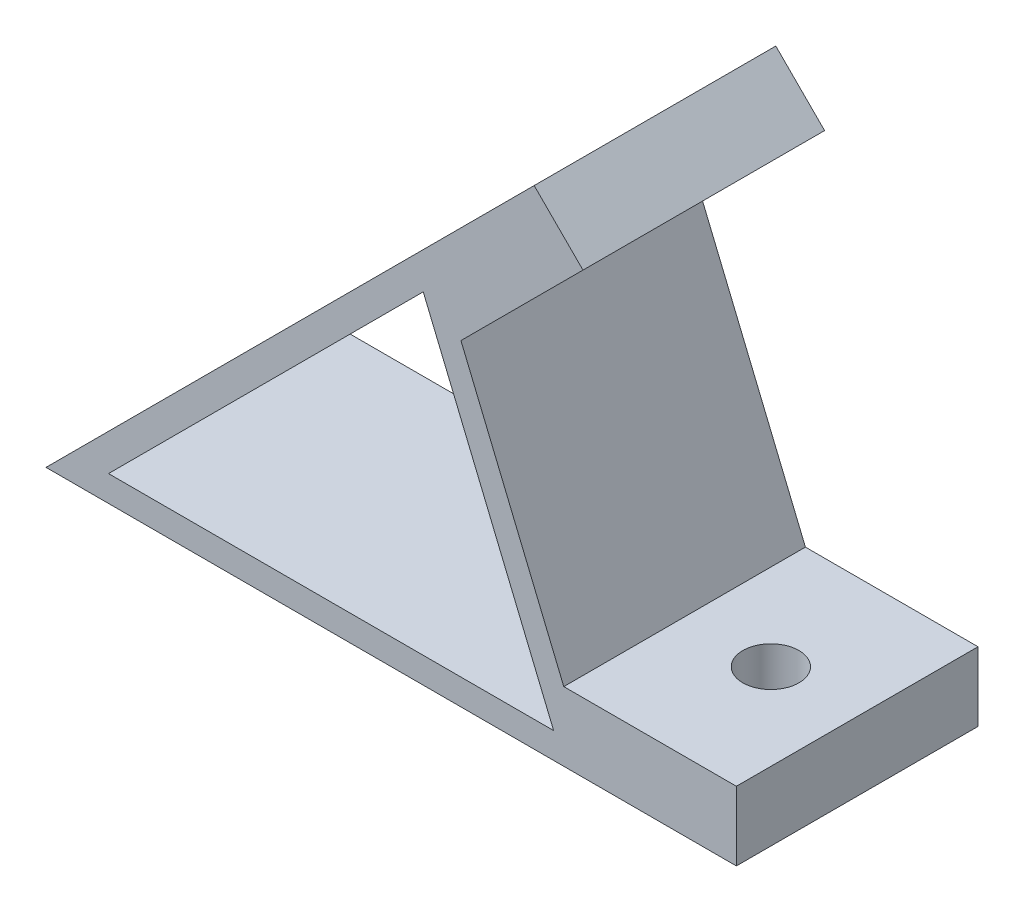
ISO-10303-21;
HEADER;
FILE_DESCRIPTION(('STEP AP214'),'2;1');
FILE_NAME('part.step','',(''),(''),'','','');
FILE_SCHEMA(('AUTOMOTIVE_DESIGN { 1 0 10303 214 1 1 1 1 }'));
ENDSEC;
DATA;
#1=APPLICATION_CONTEXT('core data for automotive mechanical design processes');
#2=APPLICATION_PROTOCOL_DEFINITION('international standard','automotive_design',2000,#1);
#3=PRODUCT_CONTEXT('',#1,'mechanical');
#4=PRODUCT('Part','Part','',(#3));
#5=PRODUCT_RELATED_PRODUCT_CATEGORY('part','',(#4));
#6=PRODUCT_DEFINITION_FORMATION('','',#4);
#7=PRODUCT_DEFINITION_CONTEXT('part definition',#1,'design');
#8=PRODUCT_DEFINITION('design','',#6,#7);
#9=PRODUCT_DEFINITION_SHAPE('','',#8);
#10=(LENGTH_UNIT() NAMED_UNIT(*) SI_UNIT(.MILLI.,.METRE.));
#11=(NAMED_UNIT(*) PLANE_ANGLE_UNIT() SI_UNIT($,.RADIAN.));
#12=(NAMED_UNIT(*) SI_UNIT($,.STERADIAN.) SOLID_ANGLE_UNIT());
#13=UNCERTAINTY_MEASURE_WITH_UNIT(LENGTH_MEASURE(1.E-05),#10,'distance_accuracy_value','');
#14=(GEOMETRIC_REPRESENTATION_CONTEXT(3) GLOBAL_UNCERTAINTY_ASSIGNED_CONTEXT((#13)) GLOBAL_UNIT_ASSIGNED_CONTEXT((#10,
#11,#12)) REPRESENTATION_CONTEXT('',''));
#15=CARTESIAN_POINT('',(0.,0.,0.));
#16=DIRECTION('',(0.,0.,1.));
#17=DIRECTION('',(1.,0.,0.));
#18=AXIS2_PLACEMENT_3D('',#15,#16,#17);
#19=CARTESIAN_POINT('',(0.,0.,28.));
#20=DIRECTION('',(0.,0.,-1.));
#21=DIRECTION('',(-1.,0.,0.));
#22=AXIS2_PLACEMENT_3D('',#19,#20,#21);
#23=PLANE('',#22);
#24=DIRECTION('',(-0.707106781186543,0.707106781186552,0.));
#25=VECTOR('',#24,1.);
#26=CARTESIAN_POINT('',(56.5685424949241,56.5685424949235,28.));
#27=LINE('',#26,#25);
#28=CARTESIAN_POINT('',(62.2253967444164,50.9116882454311,28.));
#29=VERTEX_POINT('',#28);
#30=CARTESIAN_POINT('',(56.5685424949241,56.5685424949235,28.));
#31=VERTEX_POINT('',#30);
#32=EDGE_CURVE('E141',#29,#31,#27,.T.);
#33=ORIENTED_EDGE('',*,*,#32,.T.);
#34=DIRECTION('',(-0.707106781186551,-0.707106781186544,0.));
#35=VECTOR('',#34,1.);
#36=CARTESIAN_POINT('',(56.5685424949241,56.5685424949235,28.));
#37=LINE('',#36,#35);
#38=CARTESIAN_POINT('',(0.,0.,28.));
#39=VERTEX_POINT('',#38);
#40=EDGE_CURVE('E144',#31,#39,#37,.T.);
#41=ORIENTED_EDGE('',*,*,#40,.T.);
#42=DIRECTION('',(1.,0.,0.));
#43=VECTOR('',#42,1.);
#44=CARTESIAN_POINT('',(0.,0.,28.));
#45=LINE('',#44,#43);
#46=CARTESIAN_POINT('',(80.,0.,28.));
#47=VERTEX_POINT('',#46);
#48=EDGE_CURVE('E147',#39,#47,#45,.T.);
#49=ORIENTED_EDGE('',*,*,#48,.T.);
#50=DIRECTION('',(0.,1.,0.));
#51=VECTOR('',#50,1.);
#52=CARTESIAN_POINT('',(80.,8.,28.));
#53=LINE('',#52,#51);
#54=CARTESIAN_POINT('',(80.,8.,28.));
#55=VERTEX_POINT('',#54);
#56=EDGE_CURVE('E149',#47,#55,#53,.T.);
#57=ORIENTED_EDGE('',*,*,#56,.T.);
#58=DIRECTION('',(-1.,0.,0.));
#59=VECTOR('',#58,1.);
#60=CARTESIAN_POINT('',(60.,8.,28.));
#61=LINE('',#60,#59);
#62=CARTESIAN_POINT('',(60.,8.,28.));
#63=VERTEX_POINT('',#62);
#64=EDGE_CURVE('E151',#55,#63,#61,.T.);
#65=ORIENTED_EDGE('',*,*,#64,.T.);
#66=DIRECTION('',(-0.382683432365088,0.923879532511288,0.));
#67=VECTOR('',#66,1.);
#68=CARTESIAN_POINT('',(48.0832611206854,36.7695526217002,28.));
#69=LINE('',#68,#67);
#70=CARTESIAN_POINT('',(48.0832611206854,36.7695526217002,28.));
#71=VERTEX_POINT('',#70);
#72=EDGE_CURVE('E153',#63,#71,#69,.T.);
#73=ORIENTED_EDGE('',*,*,#72,.T.);
#74=DIRECTION('',(0.707106781186551,0.707106781186544,0.));
#75=VECTOR('',#74,1.);
#76=CARTESIAN_POINT('',(62.2253967444164,50.9116882454311,28.));
#77=LINE('',#76,#75);
#78=EDGE_CURVE('E155',#71,#29,#77,.T.);
#79=ORIENTED_EDGE('',*,*,#78,.T.);
#80=EDGE_LOOP('',(#33,#41,#49,#57,#65,#73,#79));
#81=FACE_BOUND('',#80,.T.);
#82=DIRECTION('',(1.,0.,0.));
#83=VECTOR('',#82,1.);
#84=CARTESIAN_POINT('',(58.8238912109883,3.,28.));
#85=LINE('',#84,#83);
#86=CARTESIAN_POINT('',(7.24264068711934,2.99999999999999,28.));
#87=VERTEX_POINT('',#86);
#88=CARTESIAN_POINT('',(58.8238912109883,3.,28.));
#89=VERTEX_POINT('',#88);
#90=EDGE_CURVE('E112',#87,#89,#85,.T.);
#91=ORIENTED_EDGE('',*,*,#90,.F.);
#92=DIRECTION('',(-0.707106781186551,-0.707106781186544,0.));
#93=VECTOR('',#92,1.);
#94=CARTESIAN_POINT('',(7.24264068711934,2.99999999999999,28.));
#95=LINE('',#94,#93);
#96=CARTESIAN_POINT('',(43.7160927146294,39.4734520275097,28.));
#97=VERTEX_POINT('',#96);
#98=EDGE_CURVE('E129',#97,#87,#95,.T.);
#99=ORIENTED_EDGE('',*,*,#98,.F.);
#100=DIRECTION('',(-0.382683432365088,0.923879532511288,0.));
#101=VECTOR('',#100,1.);
#102=CARTESIAN_POINT('',(43.7160927146294,39.4734520275097,28.));
#103=LINE('',#102,#101);
#104=EDGE_CURVE('E120',#89,#97,#103,.T.);
#105=ORIENTED_EDGE('',*,*,#104,.F.);
#106=EDGE_LOOP('',(#91,#99,#105));
#107=FACE_BOUND('',#106,.T.);
#108=ADVANCED_FACE('F35',(#81,#107),#23,.F.);
#109=CARTESIAN_POINT('',(0.,0.,0.));
#110=DIRECTION('',(0.,0.,-1.));
#111=DIRECTION('',(-1.,0.,0.));
#112=AXIS2_PLACEMENT_3D('',#109,#110,#111);
#113=PLANE('',#112);
#114=DIRECTION('',(-0.707106781186543,0.707106781186552,0.));
#115=VECTOR('',#114,1.);
#116=CARTESIAN_POINT('',(56.5685424949241,56.5685424949235,0.));
#117=LINE('',#116,#115);
#118=CARTESIAN_POINT('',(62.2253967444164,50.9116882454311,0.));
#119=VERTEX_POINT('',#118);
#120=CARTESIAN_POINT('',(56.5685424949241,56.5685424949235,0.));
#121=VERTEX_POINT('',#120);
#122=EDGE_CURVE('E127',#119,#121,#117,.T.);
#123=ORIENTED_EDGE('',*,*,#122,.F.);
#124=DIRECTION('',(0.707106781186551,0.707106781186544,0.));
#125=VECTOR('',#124,1.);
#126=CARTESIAN_POINT('',(62.2253967444164,50.9116882454311,0.));
#127=LINE('',#126,#125);
#128=CARTESIAN_POINT('',(48.0832611206854,36.7695526217002,0.));
#129=VERTEX_POINT('',#128);
#130=EDGE_CURVE('E145',#129,#119,#127,.T.);
#131=ORIENTED_EDGE('',*,*,#130,.F.);
#132=DIRECTION('',(-0.382683432365088,0.923879532511288,0.));
#133=VECTOR('',#132,1.);
#134=CARTESIAN_POINT('',(48.0832611206854,36.7695526217002,0.));
#135=LINE('',#134,#133);
#136=CARTESIAN_POINT('',(60.,8.,0.));
#137=VERTEX_POINT('',#136);
#138=EDGE_CURVE('E168',#137,#129,#135,.T.);
#139=ORIENTED_EDGE('',*,*,#138,.F.);
#140=DIRECTION('',(-1.,0.,0.));
#141=VECTOR('',#140,1.);
#142=CARTESIAN_POINT('',(60.,8.,0.));
#143=LINE('',#142,#141);
#144=CARTESIAN_POINT('',(80.,8.,0.));
#145=VERTEX_POINT('',#144);
#146=EDGE_CURVE('E166',#145,#137,#143,.T.);
#147=ORIENTED_EDGE('',*,*,#146,.F.);
#148=DIRECTION('',(0.,1.,0.));
#149=VECTOR('',#148,1.);
#150=CARTESIAN_POINT('',(80.,8.,0.));
#151=LINE('',#150,#149);
#152=CARTESIAN_POINT('',(80.,0.,0.));
#153=VERTEX_POINT('',#152);
#154=EDGE_CURVE('E164',#153,#145,#151,.T.);
#155=ORIENTED_EDGE('',*,*,#154,.F.);
#156=DIRECTION('',(1.,0.,0.));
#157=VECTOR('',#156,1.);
#158=CARTESIAN_POINT('',(0.,0.,0.));
#159=LINE('',#158,#157);
#160=CARTESIAN_POINT('',(0.,0.,0.));
#161=VERTEX_POINT('',#160);
#162=EDGE_CURVE('E162',#161,#153,#159,.T.);
#163=ORIENTED_EDGE('',*,*,#162,.F.);
#164=DIRECTION('',(-0.707106781186551,-0.707106781186544,0.));
#165=VECTOR('',#164,1.);
#166=CARTESIAN_POINT('',(56.5685424949241,56.5685424949235,0.));
#167=LINE('',#166,#165);
#168=EDGE_CURVE('E160',#121,#161,#167,.T.);
#169=ORIENTED_EDGE('',*,*,#168,.F.);
#170=EDGE_LOOP('',(#123,#131,#139,#147,#155,#163,#169));
#171=FACE_BOUND('',#170,.T.);
#172=DIRECTION('',(-0.707106781186551,-0.707106781186544,0.));
#173=VECTOR('',#172,1.);
#174=CARTESIAN_POINT('',(7.24264068711934,2.99999999999999,0.));
#175=LINE('',#174,#173);
#176=CARTESIAN_POINT('',(43.7160927146294,39.4734520275097,0.));
#177=VERTEX_POINT('',#176);
#178=CARTESIAN_POINT('',(7.24264068711934,2.99999999999999,0.));
#179=VERTEX_POINT('',#178);
#180=EDGE_CURVE('E121',#177,#179,#175,.T.);
#181=ORIENTED_EDGE('',*,*,#180,.T.);
#182=DIRECTION('',(1.,0.,0.));
#183=VECTOR('',#182,1.);
#184=CARTESIAN_POINT('',(58.8238912109883,3.,0.));
#185=LINE('',#184,#183);
#186=CARTESIAN_POINT('',(58.8238912109883,3.,0.));
#187=VERTEX_POINT('',#186);
#188=EDGE_CURVE('E58',#179,#187,#185,.T.);
#189=ORIENTED_EDGE('',*,*,#188,.T.);
#190=DIRECTION('',(-0.382683432365088,0.923879532511288,0.));
#191=VECTOR('',#190,1.);
#192=CARTESIAN_POINT('',(43.7160927146294,39.4734520275097,0.));
#193=LINE('',#192,#191);
#194=EDGE_CURVE('E126',#187,#177,#193,.T.);
#195=ORIENTED_EDGE('',*,*,#194,.T.);
#196=EDGE_LOOP('',(#181,#189,#195));
#197=FACE_BOUND('',#196,.T.);
#198=ADVANCED_FACE('F195',(#171,#197),#113,.T.);
#199=CARTESIAN_POINT('',(56.5685424949241,56.5685424949235,28.));
#200=DIRECTION('',(-0.707106781186552,-0.707106781186543,0.));
#201=DIRECTION('',(0.707106781186543,-0.707106781186552,0.));
#202=AXIS2_PLACEMENT_3D('',#199,#200,#201);
#203=PLANE('',#202);
#204=ORIENTED_EDGE('',*,*,#122,.T.);
#205=DIRECTION('',(0.,0.,-1.));
#206=VECTOR('',#205,1.);
#207=CARTESIAN_POINT('',(56.5685424949241,56.5685424949235,28.));
#208=LINE('',#207,#206);
#209=EDGE_CURVE('E11',#31,#121,#208,.T.);
#210=ORIENTED_EDGE('',*,*,#209,.F.);
#211=ORIENTED_EDGE('',*,*,#32,.F.);
#212=DIRECTION('',(0.,0.,-1.));
#213=VECTOR('',#212,1.);
#214=CARTESIAN_POINT('',(62.2253967444164,50.9116882454311,28.));
#215=LINE('',#214,#213);
#216=EDGE_CURVE('E157',#29,#119,#215,.T.);
#217=ORIENTED_EDGE('',*,*,#216,.T.);
#218=EDGE_LOOP('',(#204,#210,#211,#217));
#219=FACE_BOUND('',#218,.T.);
#220=ADVANCED_FACE('F37',(#219),#203,.F.);
#221=CARTESIAN_POINT('',(56.5685424949241,56.5685424949235,28.));
#222=DIRECTION('',(0.707106781186544,-0.707106781186551,0.));
#223=DIRECTION('',(0.707106781186551,0.707106781186544,0.));
#224=AXIS2_PLACEMENT_3D('',#221,#222,#223);
#225=PLANE('',#224);
#226=CARTESIAN_POINT('',(49.4974746830586,49.4974746830581,14.));
#227=DIRECTION('',(0.707106781186544,-0.707106781186551,0.));
#228=DIRECTION('',(0.707106781186551,0.707106781186544,0.));
#229=AXIS2_PLACEMENT_3D('',#226,#227,#228);
#230=CIRCLE('',#229,3.25);
#231=CARTESIAN_POINT('',(51.7955717219149,51.7955717219143,14.));
#232=VERTEX_POINT('',#231);
#233=EDGE_CURVE('E262',#232,#232,#230,.T.);
#234=ORIENTED_EDGE('',*,*,#233,.T.);
#235=EDGE_LOOP('',(#234));
#236=FACE_BOUND('',#235,.T.);
#237=ORIENTED_EDGE('',*,*,#168,.T.);
#238=DIRECTION('',(0.,0.,-1.));
#239=VECTOR('',#238,1.);
#240=CARTESIAN_POINT('',(0.,0.,28.));
#241=LINE('',#240,#239);
#242=EDGE_CURVE('E43',#39,#161,#241,.T.);
#243=ORIENTED_EDGE('',*,*,#242,.F.);
#244=ORIENTED_EDGE('',*,*,#40,.F.);
#245=ORIENTED_EDGE('',*,*,#209,.T.);
#246=EDGE_LOOP('',(#237,#243,#244,#245));
#247=FACE_BOUND('',#246,.T.);
#248=ADVANCED_FACE('F212',(#236,#247),#225,.F.);
#249=CARTESIAN_POINT('',(0.,0.,28.));
#250=DIRECTION('',(0.,1.,0.));
#251=DIRECTION('',(0.,0.,1.));
#252=AXIS2_PLACEMENT_3D('',#249,#250,#251);
#253=PLANE('',#252);
#254=CARTESIAN_POINT('',(70.,0.,14.));
#255=DIRECTION('',(0.,1.,0.));
#256=DIRECTION('',(0.,0.,1.));
#257=AXIS2_PLACEMENT_3D('',#254,#255,#256);
#258=CIRCLE('',#257,3.25000000000001);
#259=CARTESIAN_POINT('',(70.,0.,17.25));
#260=VERTEX_POINT('',#259);
#261=EDGE_CURVE('E135',#260,#260,#258,.T.);
#262=ORIENTED_EDGE('',*,*,#261,.T.);
#263=EDGE_LOOP('',(#262));
#264=FACE_BOUND('',#263,.T.);
#265=ORIENTED_EDGE('',*,*,#162,.T.);
#266=DIRECTION('',(0.,0.,-1.));
#267=VECTOR('',#266,1.);
#268=CARTESIAN_POINT('',(80.,0.,28.));
#269=LINE('',#268,#267);
#270=EDGE_CURVE('E182',#47,#153,#269,.T.);
#271=ORIENTED_EDGE('',*,*,#270,.F.);
#272=ORIENTED_EDGE('',*,*,#48,.F.);
#273=ORIENTED_EDGE('',*,*,#242,.T.);
#274=EDGE_LOOP('',(#265,#271,#272,#273));
#275=FACE_BOUND('',#274,.T.);
#276=ADVANCED_FACE('F189',(#264,#275),#253,.F.);
#277=CARTESIAN_POINT('',(80.,8.,28.));
#278=DIRECTION('',(-1.,0.,0.));
#279=DIRECTION('',(0.,0.,1.));
#280=AXIS2_PLACEMENT_3D('',#277,#278,#279);
#281=PLANE('',#280);
#282=ORIENTED_EDGE('',*,*,#154,.T.);
#283=DIRECTION('',(0.,0.,-1.));
#284=VECTOR('',#283,1.);
#285=CARTESIAN_POINT('',(80.,8.,28.));
#286=LINE('',#285,#284);
#287=EDGE_CURVE('E179',#55,#145,#286,.T.);
#288=ORIENTED_EDGE('',*,*,#287,.F.);
#289=ORIENTED_EDGE('',*,*,#56,.F.);
#290=ORIENTED_EDGE('',*,*,#270,.T.);
#291=EDGE_LOOP('',(#282,#288,#289,#290));
#292=FACE_BOUND('',#291,.T.);
#293=ADVANCED_FACE('F201',(#292),#281,.F.);
#294=CARTESIAN_POINT('',(60.,8.,28.));
#295=DIRECTION('',(0.,-1.,0.));
#296=DIRECTION('',(0.,0.,-1.));
#297=AXIS2_PLACEMENT_3D('',#294,#295,#296);
#298=PLANE('',#297);
#299=CARTESIAN_POINT('',(70.,8.,14.));
#300=DIRECTION('',(0.,1.,0.));
#301=DIRECTION('',(0.,0.,1.));
#302=AXIS2_PLACEMENT_3D('',#299,#300,#301);
#303=CIRCLE('',#302,3.25000000000001);
#304=CARTESIAN_POINT('',(70.,8.,17.25));
#305=VERTEX_POINT('',#304);
#306=EDGE_CURVE('E264',#305,#305,#303,.T.);
#307=ORIENTED_EDGE('',*,*,#306,.F.);
#308=EDGE_LOOP('',(#307));
#309=FACE_BOUND('',#308,.T.);
#310=ORIENTED_EDGE('',*,*,#146,.T.);
#311=DIRECTION('',(0.,0.,-1.));
#312=VECTOR('',#311,1.);
#313=CARTESIAN_POINT('',(60.,8.,28.));
#314=LINE('',#313,#312);
#315=EDGE_CURVE('E176',#63,#137,#314,.T.);
#316=ORIENTED_EDGE('',*,*,#315,.F.);
#317=ORIENTED_EDGE('',*,*,#64,.F.);
#318=ORIENTED_EDGE('',*,*,#287,.T.);
#319=EDGE_LOOP('',(#310,#316,#317,#318));
#320=FACE_BOUND('',#319,.T.);
#321=ADVANCED_FACE('F205',(#309,#320),#298,.F.);
#322=CARTESIAN_POINT('',(48.0832611206854,36.7695526217002,28.));
#323=DIRECTION('',(-0.923879532511288,-0.382683432365088,0.));
#324=DIRECTION('',(0.382683432365088,-0.923879532511288,0.));
#325=AXIS2_PLACEMENT_3D('',#322,#323,#324);
#326=PLANE('',#325);
#327=ORIENTED_EDGE('',*,*,#138,.T.);
#328=DIRECTION('',(0.,0.,-1.));
#329=VECTOR('',#328,1.);
#330=CARTESIAN_POINT('',(48.0832611206854,36.7695526217002,28.));
#331=LINE('',#330,#329);
#332=EDGE_CURVE('E173',#71,#129,#331,.T.);
#333=ORIENTED_EDGE('',*,*,#332,.F.);
#334=ORIENTED_EDGE('',*,*,#72,.F.);
#335=ORIENTED_EDGE('',*,*,#315,.T.);
#336=EDGE_LOOP('',(#327,#333,#334,#335));
#337=FACE_BOUND('',#336,.T.);
#338=ADVANCED_FACE('F220',(#337),#326,.F.);
#339=CARTESIAN_POINT('',(62.2253967444164,50.9116882454311,28.));
#340=DIRECTION('',(-0.707106781186544,0.707106781186551,0.));
#341=DIRECTION('',(-0.707106781186551,-0.707106781186544,0.));
#342=AXIS2_PLACEMENT_3D('',#339,#340,#341);
#343=PLANE('',#342);
#344=CARTESIAN_POINT('',(55.1543289325509,43.8406204335657,14.));
#345=DIRECTION('',(0.707106781186544,-0.707106781186551,0.));
#346=DIRECTION('',(0.707106781186551,0.707106781186544,0.));
#347=AXIS2_PLACEMENT_3D('',#344,#345,#346);
#348=CIRCLE('',#347,3.25);
#349=CARTESIAN_POINT('',(57.4524259714072,46.1387174724219,14.));
#350=VERTEX_POINT('',#349);
#351=EDGE_CURVE('E259',#350,#350,#348,.T.);
#352=ORIENTED_EDGE('',*,*,#351,.F.);
#353=EDGE_LOOP('',(#352));
#354=FACE_BOUND('',#353,.T.);
#355=ORIENTED_EDGE('',*,*,#130,.T.);
#356=ORIENTED_EDGE('',*,*,#216,.F.);
#357=ORIENTED_EDGE('',*,*,#78,.F.);
#358=ORIENTED_EDGE('',*,*,#332,.T.);
#359=EDGE_LOOP('',(#355,#356,#357,#358));
#360=FACE_BOUND('',#359,.T.);
#361=ADVANCED_FACE('F217',(#354,#360),#343,.F.);
#362=CARTESIAN_POINT('',(58.8238912109883,3.,28.));
#363=DIRECTION('',(0.,1.,0.));
#364=DIRECTION('',(-1.,0.,0.));
#365=AXIS2_PLACEMENT_3D('',#362,#363,#364);
#366=PLANE('',#365);
#367=ORIENTED_EDGE('',*,*,#188,.F.);
#368=DIRECTION('',(0.,0.,-1.));
#369=VECTOR('',#368,1.);
#370=CARTESIAN_POINT('',(7.24264068711934,2.99999999999999,28.));
#371=LINE('',#370,#369);
#372=EDGE_CURVE('E116',#87,#179,#371,.T.);
#373=ORIENTED_EDGE('',*,*,#372,.F.);
#374=ORIENTED_EDGE('',*,*,#90,.T.);
#375=DIRECTION('',(0.,0.,-1.));
#376=VECTOR('',#375,1.);
#377=CARTESIAN_POINT('',(58.8238912109883,3.,28.));
#378=LINE('',#377,#376);
#379=EDGE_CURVE('E115',#89,#187,#378,.T.);
#380=ORIENTED_EDGE('',*,*,#379,.T.);
#381=EDGE_LOOP('',(#367,#373,#374,#380));
#382=FACE_BOUND('',#381,.T.);
#383=ADVANCED_FACE('F114',(#382),#366,.T.);
#384=CARTESIAN_POINT('',(43.7160927146294,39.4734520275097,28.));
#385=DIRECTION('',(-0.923879532511288,-0.382683432365087,0.));
#386=DIRECTION('',(0.382683432365087,-0.923879532511288,0.));
#387=AXIS2_PLACEMENT_3D('',#384,#385,#386);
#388=PLANE('',#387);
#389=ORIENTED_EDGE('',*,*,#194,.F.);
#390=ORIENTED_EDGE('',*,*,#379,.F.);
#391=ORIENTED_EDGE('',*,*,#104,.T.);
#392=DIRECTION('',(0.,0.,-1.));
#393=VECTOR('',#392,1.);
#394=CARTESIAN_POINT('',(43.7160927146294,39.4734520275097,28.));
#395=LINE('',#394,#393);
#396=EDGE_CURVE('E50',#97,#177,#395,.T.);
#397=ORIENTED_EDGE('',*,*,#396,.T.);
#398=EDGE_LOOP('',(#389,#390,#391,#397));
#399=FACE_BOUND('',#398,.T.);
#400=ADVANCED_FACE('F124',(#399),#388,.T.);
#401=CARTESIAN_POINT('',(7.24264068711934,2.99999999999999,28.));
#402=DIRECTION('',(0.707106781186544,-0.707106781186551,0.));
#403=DIRECTION('',(0.707106781186551,0.707106781186544,0.));
#404=AXIS2_PLACEMENT_3D('',#401,#402,#403);
#405=PLANE('',#404);
#406=ORIENTED_EDGE('',*,*,#180,.F.);
#407=ORIENTED_EDGE('',*,*,#396,.F.);
#408=ORIENTED_EDGE('',*,*,#98,.T.);
#409=ORIENTED_EDGE('',*,*,#372,.T.);
#410=EDGE_LOOP('',(#406,#407,#408,#409));
#411=FACE_BOUND('',#410,.T.);
#412=ADVANCED_FACE('F244',(#411),#405,.T.);
#413=CARTESIAN_POINT('',(70.,-2.,14.));
#414=DIRECTION('',(0.,1.,0.));
#415=DIRECTION('',(0.,0.,1.));
#416=AXIS2_PLACEMENT_3D('',#413,#414,#415);
#417=CYLINDRICAL_SURFACE('',#416,3.25000000000001);
#418=ORIENTED_EDGE('',*,*,#306,.T.);
#419=EDGE_LOOP('',(#418));
#420=FACE_BOUND('',#419,.T.);
#421=ORIENTED_EDGE('',*,*,#261,.F.);
#422=EDGE_LOOP('',(#421));
#423=FACE_BOUND('',#422,.T.);
#424=ADVANCED_FACE('F247',(#420,#423),#417,.F.);
#425=CARTESIAN_POINT('',(48.0832611206855,50.9116882454312,14.));
#426=DIRECTION('',(0.707106781186544,-0.707106781186551,0.));
#427=DIRECTION('',(0.707106781186551,0.707106781186544,0.));
#428=AXIS2_PLACEMENT_3D('',#425,#426,#427);
#429=CYLINDRICAL_SURFACE('',#428,3.25);
#430=ORIENTED_EDGE('',*,*,#351,.T.);
#431=EDGE_LOOP('',(#430));
#432=FACE_BOUND('',#431,.T.);
#433=ORIENTED_EDGE('',*,*,#233,.F.);
#434=EDGE_LOOP('',(#433));
#435=FACE_BOUND('',#434,.T.);
#436=ADVANCED_FACE('F250',(#432,#435),#429,.F.);
#437=CLOSED_SHELL('',(#108,#198,#220,#248,#276,#293,#321,#338,#361,#383,#400,#412,#424,#436));
#438=MANIFOLD_SOLID_BREP('B2',#437);
#439=ADVANCED_BREP_SHAPE_REPRESENTATION('',(#18,#438),#14);
#440=SHAPE_DEFINITION_REPRESENTATION(#9,#439);
ENDSEC;
END-ISO-10303-21;
